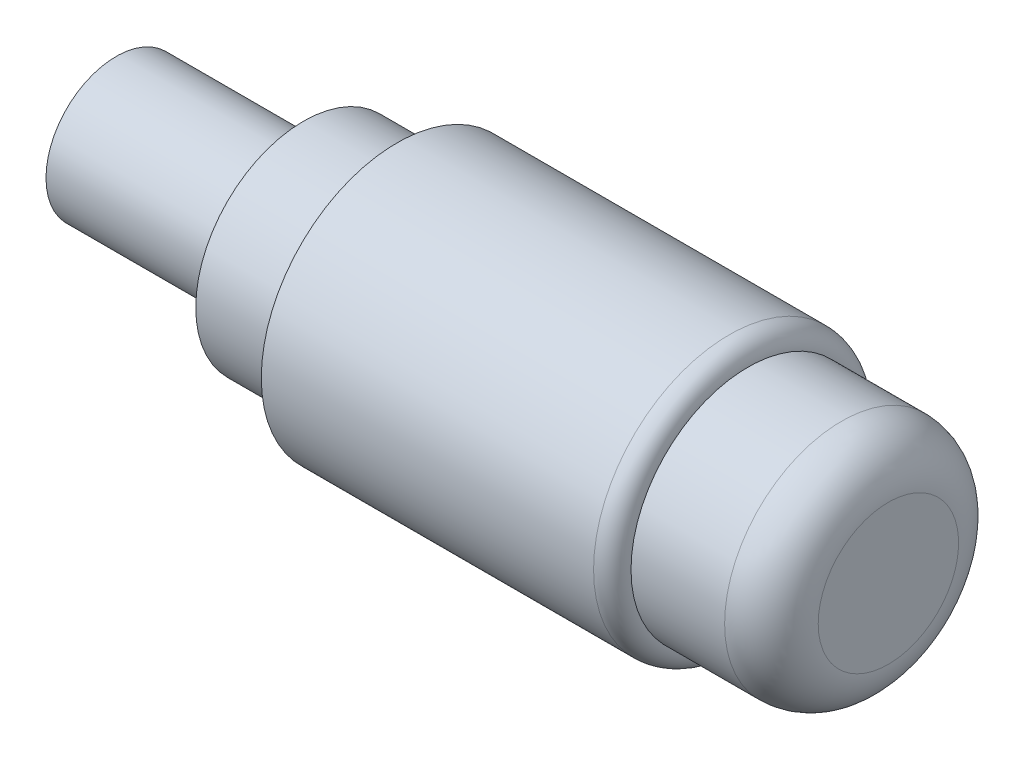
ISO-10303-21;
HEADER;
FILE_DESCRIPTION(('STEP AP214'),'2;1');
FILE_NAME('part.step','',(''),(''),'','','');
FILE_SCHEMA(('AUTOMOTIVE_DESIGN { 1 0 10303 214 1 1 1 1 }'));
ENDSEC;
DATA;
#1=APPLICATION_CONTEXT('core data for automotive mechanical design processes');
#2=APPLICATION_PROTOCOL_DEFINITION('international standard','automotive_design',2000,#1);
#3=PRODUCT_CONTEXT('',#1,'mechanical');
#4=PRODUCT('Part','Part','',(#3));
#5=PRODUCT_RELATED_PRODUCT_CATEGORY('part','',(#4));
#6=PRODUCT_DEFINITION_FORMATION('','',#4);
#7=PRODUCT_DEFINITION_CONTEXT('part definition',#1,'design');
#8=PRODUCT_DEFINITION('design','',#6,#7);
#9=PRODUCT_DEFINITION_SHAPE('','',#8);
#10=(LENGTH_UNIT() NAMED_UNIT(*) SI_UNIT(.MILLI.,.METRE.));
#11=(NAMED_UNIT(*) PLANE_ANGLE_UNIT() SI_UNIT($,.RADIAN.));
#12=(NAMED_UNIT(*) SI_UNIT($,.STERADIAN.) SOLID_ANGLE_UNIT());
#13=UNCERTAINTY_MEASURE_WITH_UNIT(LENGTH_MEASURE(1.E-05),#10,'distance_accuracy_value','');
#14=(GEOMETRIC_REPRESENTATION_CONTEXT(3) GLOBAL_UNCERTAINTY_ASSIGNED_CONTEXT((#13)) GLOBAL_UNIT_ASSIGNED_CONTEXT((#10,
#11,#12)) REPRESENTATION_CONTEXT('',''));
#15=CARTESIAN_POINT('',(0.,0.,0.));
#16=DIRECTION('',(0.,0.,1.));
#17=DIRECTION('',(1.,0.,0.));
#18=AXIS2_PLACEMENT_3D('',#15,#16,#17);
#19=CARTESIAN_POINT('',(0.,0.,0.));
#20=DIRECTION('',(1.,0.,0.));
#21=DIRECTION('',(0.,0.,-1.));
#22=AXIS2_PLACEMENT_3D('',#19,#20,#21);
#23=PLANE('',#22);
#24=CARTESIAN_POINT('',(0.,0.,0.));
#25=DIRECTION('',(-1.,0.,0.));
#26=DIRECTION('',(0.,0.,1.));
#27=AXIS2_PLACEMENT_3D('',#24,#25,#26);
#28=CIRCLE('',#27,1.5);
#29=CARTESIAN_POINT('',(0.,0.,1.5));
#30=VERTEX_POINT('',#29);
#31=EDGE_CURVE('E10',#30,#30,#28,.T.);
#32=ORIENTED_EDGE('',*,*,#31,.T.);
#33=EDGE_LOOP('',(#32));
#34=FACE_BOUND('',#33,.T.);
#35=ADVANCED_FACE('F35',(#34),#23,.F.);
#36=CARTESIAN_POINT('',(-9.40440003139143,0.,0.));
#37=DIRECTION('',(-1.,0.,0.));
#38=DIRECTION('',(0.,0.,1.));
#39=AXIS2_PLACEMENT_3D('',#36,#37,#38);
#40=CYLINDRICAL_SURFACE('',#39,1.5);
#41=ORIENTED_EDGE('',*,*,#31,.F.);
#42=EDGE_LOOP('',(#41));
#43=FACE_BOUND('',#42,.T.);
#44=CARTESIAN_POINT('',(4.,0.,0.));
#45=DIRECTION('',(-1.,0.,0.));
#46=DIRECTION('',(0.,0.,1.));
#47=AXIS2_PLACEMENT_3D('',#44,#45,#46);
#48=CIRCLE('',#47,1.5);
#49=CARTESIAN_POINT('',(4.,0.,1.5));
#50=VERTEX_POINT('',#49);
#51=EDGE_CURVE('E41',#50,#50,#48,.T.);
#52=ORIENTED_EDGE('',*,*,#51,.T.);
#53=EDGE_LOOP('',(#52));
#54=FACE_BOUND('',#53,.T.);
#55=ADVANCED_FACE('F82',(#43,#54),#40,.T.);
#56=CARTESIAN_POINT('',(4.,1.5,0.));
#57=DIRECTION('',(1.,0.,0.));
#58=DIRECTION('',(0.,0.,-1.));
#59=AXIS2_PLACEMENT_3D('',#56,#57,#58);
#60=PLANE('',#59);
#61=ORIENTED_EDGE('',*,*,#51,.F.);
#62=EDGE_LOOP('',(#61));
#63=FACE_BOUND('',#62,.T.);
#64=CARTESIAN_POINT('',(4.,0.,0.));
#65=DIRECTION('',(-1.,0.,0.));
#66=DIRECTION('',(0.,0.,1.));
#67=AXIS2_PLACEMENT_3D('',#64,#65,#66);
#68=CIRCLE('',#67,2.3);
#69=CARTESIAN_POINT('',(4.,0.,2.3));
#70=VERTEX_POINT('',#69);
#71=EDGE_CURVE('E45',#70,#70,#68,.T.);
#72=ORIENTED_EDGE('',*,*,#71,.T.);
#73=EDGE_LOOP('',(#72));
#74=FACE_BOUND('',#73,.T.);
#75=ADVANCED_FACE('F86',(#63,#74),#60,.F.);
#76=CARTESIAN_POINT('',(-9.40440003139143,0.,0.));
#77=DIRECTION('',(-1.,0.,0.));
#78=DIRECTION('',(0.,0.,1.));
#79=AXIS2_PLACEMENT_3D('',#76,#77,#78);
#80=CYLINDRICAL_SURFACE('',#79,2.3);
#81=ORIENTED_EDGE('',*,*,#71,.F.);
#82=EDGE_LOOP('',(#81));
#83=FACE_BOUND('',#82,.T.);
#84=CARTESIAN_POINT('',(6.,0.,0.));
#85=DIRECTION('',(-1.,0.,0.));
#86=DIRECTION('',(0.,0.,1.));
#87=AXIS2_PLACEMENT_3D('',#84,#85,#86);
#88=CIRCLE('',#87,2.3);
#89=CARTESIAN_POINT('',(6.,0.,2.3));
#90=VERTEX_POINT('',#89);
#91=EDGE_CURVE('E49',#90,#90,#88,.T.);
#92=ORIENTED_EDGE('',*,*,#91,.T.);
#93=EDGE_LOOP('',(#92));
#94=FACE_BOUND('',#93,.T.);
#95=ADVANCED_FACE('F91',(#83,#94),#80,.T.);
#96=CARTESIAN_POINT('',(6.,2.3,0.));
#97=DIRECTION('',(1.,0.,0.));
#98=DIRECTION('',(0.,0.,-1.));
#99=AXIS2_PLACEMENT_3D('',#96,#97,#98);
#100=PLANE('',#99);
#101=ORIENTED_EDGE('',*,*,#91,.F.);
#102=EDGE_LOOP('',(#101));
#103=FACE_BOUND('',#102,.T.);
#104=CARTESIAN_POINT('',(6.,0.,0.));
#105=DIRECTION('',(-1.,0.,0.));
#106=DIRECTION('',(0.,0.,1.));
#107=AXIS2_PLACEMENT_3D('',#104,#105,#106);
#108=CIRCLE('',#107,2.9);
#109=CARTESIAN_POINT('',(6.,0.,2.9));
#110=VERTEX_POINT('',#109);
#111=EDGE_CURVE('E54',#110,#110,#108,.T.);
#112=ORIENTED_EDGE('',*,*,#111,.T.);
#113=EDGE_LOOP('',(#112));
#114=FACE_BOUND('',#113,.T.);
#115=ADVANCED_FACE('F97',(#103,#114),#100,.F.);
#116=CARTESIAN_POINT('',(-9.40440003139143,0.,0.));
#117=DIRECTION('',(-1.,0.,0.));
#118=DIRECTION('',(0.,0.,1.));
#119=AXIS2_PLACEMENT_3D('',#116,#117,#118);
#120=CYLINDRICAL_SURFACE('',#119,2.9);
#121=ORIENTED_EDGE('',*,*,#111,.F.);
#122=EDGE_LOOP('',(#121));
#123=FACE_BOUND('',#122,.T.);
#124=CARTESIAN_POINT('',(13.1,0.,0.));
#125=DIRECTION('',(-1.,0.,0.));
#126=DIRECTION('',(0.,0.,1.));
#127=AXIS2_PLACEMENT_3D('',#124,#125,#126);
#128=CIRCLE('',#127,2.9);
#129=CARTESIAN_POINT('',(13.1,0.,2.9));
#130=VERTEX_POINT('',#129);
#131=EDGE_CURVE('E57',#130,#130,#128,.T.);
#132=ORIENTED_EDGE('',*,*,#131,.T.);
#133=EDGE_LOOP('',(#132));
#134=FACE_BOUND('',#133,.T.);
#135=ADVANCED_FACE('F101',(#123,#134),#120,.T.);
#136=CARTESIAN_POINT('',(13.1,0.,0.));
#137=DIRECTION('',(-1.,0.,0.));
#138=DIRECTION('',(0.,0.,1.));
#139=AXIS2_PLACEMENT_3D('',#136,#137,#138);
#140=TOROIDAL_SURFACE('',#139,2.5,0.399999999999998);
#141=ORIENTED_EDGE('',*,*,#131,.F.);
#142=EDGE_LOOP('',(#141));
#143=FACE_BOUND('',#142,.T.);
#144=CARTESIAN_POINT('',(13.5,0.,0.));
#145=DIRECTION('',(-1.,0.,0.));
#146=DIRECTION('',(0.,0.,1.));
#147=AXIS2_PLACEMENT_3D('',#144,#145,#146);
#148=CIRCLE('',#147,2.5);
#149=CARTESIAN_POINT('',(13.5,0.,2.5));
#150=VERTEX_POINT('',#149);
#151=EDGE_CURVE('E60',#150,#150,#148,.T.);
#152=ORIENTED_EDGE('',*,*,#151,.T.);
#153=EDGE_LOOP('',(#152));
#154=FACE_BOUND('',#153,.T.);
#155=ADVANCED_FACE('F105',(#143,#154),#140,.T.);
#156=CARTESIAN_POINT('',(-9.40440003139143,0.,0.));
#157=DIRECTION('',(-1.,0.,0.));
#158=DIRECTION('',(0.,0.,1.));
#159=AXIS2_PLACEMENT_3D('',#156,#157,#158);
#160=CYLINDRICAL_SURFACE('',#159,2.5);
#161=ORIENTED_EDGE('',*,*,#151,.F.);
#162=EDGE_LOOP('',(#161));
#163=FACE_BOUND('',#162,.T.);
#164=CARTESIAN_POINT('',(15.5,0.,0.));
#165=DIRECTION('',(-1.,0.,0.));
#166=DIRECTION('',(0.,0.,1.));
#167=AXIS2_PLACEMENT_3D('',#164,#165,#166);
#168=CIRCLE('',#167,2.5);
#169=CARTESIAN_POINT('',(15.5,0.,2.5));
#170=VERTEX_POINT('',#169);
#171=EDGE_CURVE('E63',#170,#170,#168,.T.);
#172=ORIENTED_EDGE('',*,*,#171,.T.);
#173=EDGE_LOOP('',(#172));
#174=FACE_BOUND('',#173,.T.);
#175=ADVANCED_FACE('F78',(#163,#174),#160,.T.);
#176=CARTESIAN_POINT('',(15.5,0.,0.));
#177=DIRECTION('',(-1.,0.,0.));
#178=DIRECTION('',(0.,0.,1.));
#179=AXIS2_PLACEMENT_3D('',#176,#177,#178);
#180=TOROIDAL_SURFACE('',#179,1.5,0.999999999999999);
#181=ORIENTED_EDGE('',*,*,#171,.F.);
#182=EDGE_LOOP('',(#181));
#183=FACE_BOUND('',#182,.T.);
#184=CARTESIAN_POINT('',(16.5,0.,0.));
#185=DIRECTION('',(-1.,0.,0.));
#186=DIRECTION('',(0.,0.,1.));
#187=AXIS2_PLACEMENT_3D('',#184,#185,#186);
#188=CIRCLE('',#187,1.5);
#189=CARTESIAN_POINT('',(16.5,0.,1.5));
#190=VERTEX_POINT('',#189);
#191=EDGE_CURVE('E66',#190,#190,#188,.T.);
#192=ORIENTED_EDGE('',*,*,#191,.T.);
#193=EDGE_LOOP('',(#192));
#194=FACE_BOUND('',#193,.T.);
#195=ADVANCED_FACE('F70',(#183,#194),#180,.T.);
#196=CARTESIAN_POINT('',(16.5,1.5,0.));
#197=DIRECTION('',(-1.,0.,0.));
#198=DIRECTION('',(0.,0.,1.));
#199=AXIS2_PLACEMENT_3D('',#196,#197,#198);
#200=PLANE('',#199);
#201=ORIENTED_EDGE('',*,*,#191,.F.);
#202=EDGE_LOOP('',(#201));
#203=FACE_BOUND('',#202,.T.);
#204=ADVANCED_FACE('F72',(#203),#200,.F.);
#205=CLOSED_SHELL('',(#35,#55,#75,#95,#115,#135,#155,#175,#195,#204));
#206=MANIFOLD_SOLID_BREP('B2',#205);
#207=ADVANCED_BREP_SHAPE_REPRESENTATION('',(#18,#206),#14);
#208=SHAPE_DEFINITION_REPRESENTATION(#9,#207);
ENDSEC;
END-ISO-10303-21;
